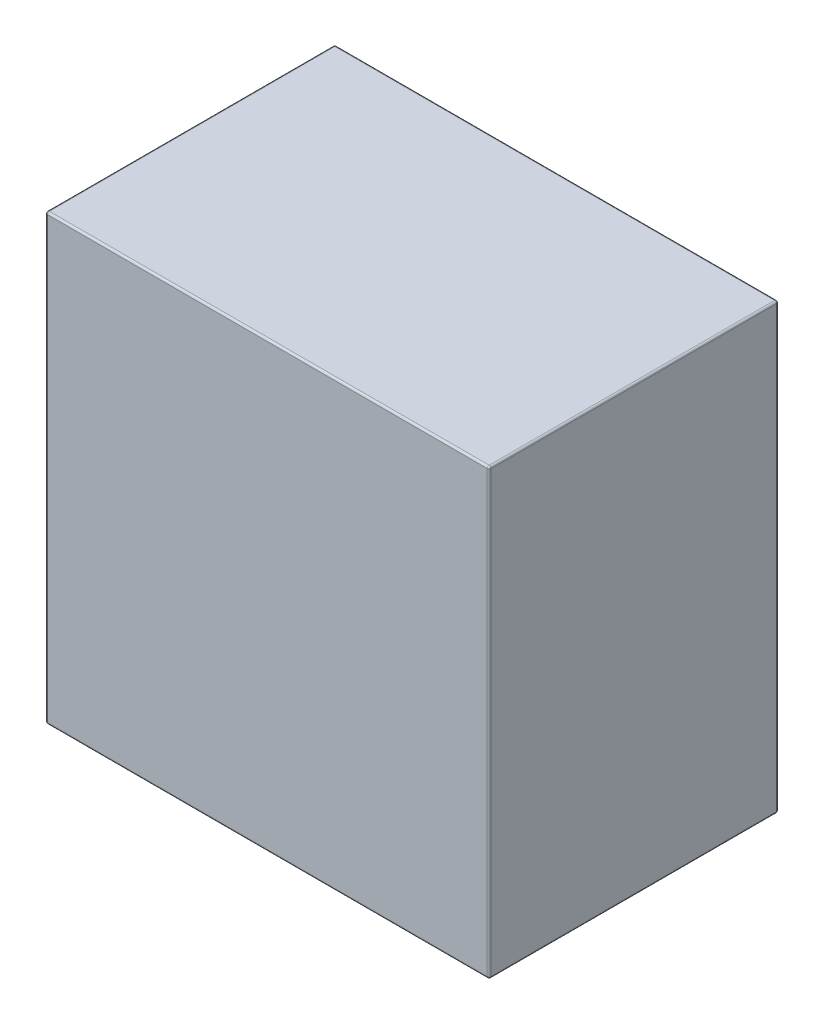
ISO-10303-21;
HEADER;
FILE_DESCRIPTION(('STEP AP214'),'2;1');
FILE_NAME('part.step','',(''),(''),'','','');
FILE_SCHEMA(('AUTOMOTIVE_DESIGN { 1 0 10303 214 1 1 1 1 }'));
ENDSEC;
DATA;
#1=APPLICATION_CONTEXT('core data for automotive mechanical design processes');
#2=APPLICATION_PROTOCOL_DEFINITION('international standard','automotive_design',2000,#1);
#3=PRODUCT_CONTEXT('',#1,'mechanical');
#4=PRODUCT('Part','Part','',(#3));
#5=PRODUCT_RELATED_PRODUCT_CATEGORY('part','',(#4));
#6=PRODUCT_DEFINITION_FORMATION('','',#4);
#7=PRODUCT_DEFINITION_CONTEXT('part definition',#1,'design');
#8=PRODUCT_DEFINITION('design','',#6,#7);
#9=PRODUCT_DEFINITION_SHAPE('','',#8);
#10=(LENGTH_UNIT() NAMED_UNIT(*) SI_UNIT(.MILLI.,.METRE.));
#11=(NAMED_UNIT(*) PLANE_ANGLE_UNIT() SI_UNIT($,.RADIAN.));
#12=(NAMED_UNIT(*) SI_UNIT($,.STERADIAN.) SOLID_ANGLE_UNIT());
#13=UNCERTAINTY_MEASURE_WITH_UNIT(LENGTH_MEASURE(1.E-05),#10,'distance_accuracy_value','');
#14=(GEOMETRIC_REPRESENTATION_CONTEXT(3) GLOBAL_UNCERTAINTY_ASSIGNED_CONTEXT((#13)) GLOBAL_UNIT_ASSIGNED_CONTEXT((#10,
#11,#12)) REPRESENTATION_CONTEXT('',''));
#15=CARTESIAN_POINT('',(0.,0.,0.));
#16=DIRECTION('',(0.,0.,1.));
#17=DIRECTION('',(1.,0.,0.));
#18=AXIS2_PLACEMENT_3D('',#15,#16,#17);
#19=CARTESIAN_POINT('',(11.5,11.5,15.));
#20=DIRECTION('',(0.,-1.,0.));
#21=DIRECTION('',(0.,0.,-1.));
#22=AXIS2_PLACEMENT_3D('',#19,#20,#21);
#23=PLANE('',#22);
#24=DIRECTION('',(0.,0.,-1.));
#25=VECTOR('',#24,1.);
#26=CARTESIAN_POINT('',(-11.4,11.5,15.));
#27=LINE('',#26,#25);
#28=CARTESIAN_POINT('',(-11.4,11.5,0.0999999999999994));
#29=VERTEX_POINT('',#28);
#30=CARTESIAN_POINT('',(-11.4,11.5,14.9));
#31=VERTEX_POINT('',#30);
#32=EDGE_CURVE('E138',#29,#31,#27,.F.);
#33=ORIENTED_EDGE('',*,*,#32,.T.);
#34=DIRECTION('',(-1.,0.,0.));
#35=VECTOR('',#34,1.);
#36=CARTESIAN_POINT('',(11.5,11.5,14.9));
#37=LINE('',#36,#35);
#38=CARTESIAN_POINT('',(11.4,11.5,14.9));
#39=VERTEX_POINT('',#38);
#40=EDGE_CURVE('E175',#31,#39,#37,.F.);
#41=ORIENTED_EDGE('',*,*,#40,.T.);
#42=DIRECTION('',(0.,0.,-1.));
#43=VECTOR('',#42,1.);
#44=CARTESIAN_POINT('',(11.4,11.5,15.));
#45=LINE('',#44,#43);
#46=CARTESIAN_POINT('',(11.4,11.5,0.0999999999999994));
#47=VERTEX_POINT('',#46);
#48=EDGE_CURVE('E172',#39,#47,#45,.T.);
#49=ORIENTED_EDGE('',*,*,#48,.T.);
#50=DIRECTION('',(-1.,0.,0.));
#51=VECTOR('',#50,1.);
#52=CARTESIAN_POINT('',(-11.5,11.5,0.0999999999999994));
#53=LINE('',#52,#51);
#54=EDGE_CURVE('E167',#47,#29,#53,.T.);
#55=ORIENTED_EDGE('',*,*,#54,.T.);
#56=EDGE_LOOP('',(#33,#41,#49,#55));
#57=FACE_BOUND('',#56,.T.);
#58=ADVANCED_FACE('F43',(#57),#23,.F.);
#59=CARTESIAN_POINT('',(-11.5,-11.5,15.));
#60=DIRECTION('',(1.,0.,0.));
#61=DIRECTION('',(0.,0.,-1.));
#62=AXIS2_PLACEMENT_3D('',#59,#60,#61);
#63=PLANE('',#62);
#64=DIRECTION('',(0.,0.,-1.));
#65=VECTOR('',#64,1.);
#66=CARTESIAN_POINT('',(-11.5,-11.4,15.));
#67=LINE('',#66,#65);
#68=CARTESIAN_POINT('',(-11.5,-11.4,0.0999999999999994));
#69=VERTEX_POINT('',#68);
#70=CARTESIAN_POINT('',(-11.5,-11.4,14.9));
#71=VERTEX_POINT('',#70);
#72=EDGE_CURVE('E160',#69,#71,#67,.F.);
#73=ORIENTED_EDGE('',*,*,#72,.T.);
#74=DIRECTION('',(0.,-1.,0.));
#75=VECTOR('',#74,1.);
#76=CARTESIAN_POINT('',(-11.5,-11.5,14.9));
#77=LINE('',#76,#75);
#78=CARTESIAN_POINT('',(-11.5,11.4,14.9));
#79=VERTEX_POINT('',#78);
#80=EDGE_CURVE('E164',#71,#79,#77,.F.);
#81=ORIENTED_EDGE('',*,*,#80,.T.);
#82=DIRECTION('',(0.,0.,-1.));
#83=VECTOR('',#82,1.);
#84=CARTESIAN_POINT('',(-11.5,11.4,15.));
#85=LINE('',#84,#83);
#86=CARTESIAN_POINT('',(-11.5,11.4,0.0999999999999994));
#87=VERTEX_POINT('',#86);
#88=EDGE_CURVE('E136',#79,#87,#85,.T.);
#89=ORIENTED_EDGE('',*,*,#88,.T.);
#90=DIRECTION('',(0.,-1.,0.));
#91=VECTOR('',#90,1.);
#92=CARTESIAN_POINT('',(-11.5,-11.5,0.0999999999999994));
#93=LINE('',#92,#91);
#94=EDGE_CURVE('E154',#87,#69,#93,.T.);
#95=ORIENTED_EDGE('',*,*,#94,.T.);
#96=EDGE_LOOP('',(#73,#81,#89,#95));
#97=FACE_BOUND('',#96,.T.);
#98=ADVANCED_FACE('F162',(#97),#63,.F.);
#99=CARTESIAN_POINT('',(11.5,-11.5,15.));
#100=DIRECTION('',(0.,1.,0.));
#101=DIRECTION('',(0.,0.,1.));
#102=AXIS2_PLACEMENT_3D('',#99,#100,#101);
#103=PLANE('',#102);
#104=DIRECTION('',(0.,0.,-1.));
#105=VECTOR('',#104,1.);
#106=CARTESIAN_POINT('',(11.4,-11.5,15.));
#107=LINE('',#106,#105);
#108=CARTESIAN_POINT('',(11.4,-11.5,0.0999999999999994));
#109=VERTEX_POINT('',#108);
#110=CARTESIAN_POINT('',(11.4,-11.5,14.9));
#111=VERTEX_POINT('',#110);
#112=EDGE_CURVE('E179',#109,#111,#107,.F.);
#113=ORIENTED_EDGE('',*,*,#112,.T.);
#114=DIRECTION('',(1.,0.,0.));
#115=VECTOR('',#114,1.);
#116=CARTESIAN_POINT('',(11.5,-11.5,14.9));
#117=LINE('',#116,#115);
#118=CARTESIAN_POINT('',(-11.4,-11.5,14.9));
#119=VERTEX_POINT('',#118);
#120=EDGE_CURVE('E184',#111,#119,#117,.F.);
#121=ORIENTED_EDGE('',*,*,#120,.T.);
#122=DIRECTION('',(0.,0.,-1.));
#123=VECTOR('',#122,1.);
#124=CARTESIAN_POINT('',(-11.4,-11.5,15.));
#125=LINE('',#124,#123);
#126=CARTESIAN_POINT('',(-11.4,-11.5,0.0999999999999994));
#127=VERTEX_POINT('',#126);
#128=EDGE_CURVE('E181',#119,#127,#125,.T.);
#129=ORIENTED_EDGE('',*,*,#128,.T.);
#130=DIRECTION('',(1.,0.,0.));
#131=VECTOR('',#130,1.);
#132=CARTESIAN_POINT('',(11.5,-11.5,0.0999999999999994));
#133=LINE('',#132,#131);
#134=EDGE_CURVE('E177',#127,#109,#133,.T.);
#135=ORIENTED_EDGE('',*,*,#134,.T.);
#136=EDGE_LOOP('',(#113,#121,#129,#135));
#137=FACE_BOUND('',#136,.T.);
#138=ADVANCED_FACE('F289',(#137),#103,.F.);
#139=CARTESIAN_POINT('',(11.5,-11.5,15.));
#140=DIRECTION('',(-1.,0.,0.));
#141=DIRECTION('',(0.,0.,1.));
#142=AXIS2_PLACEMENT_3D('',#139,#140,#141);
#143=PLANE('',#142);
#144=DIRECTION('',(0.,0.,-1.));
#145=VECTOR('',#144,1.);
#146=CARTESIAN_POINT('',(11.5,11.4,15.));
#147=LINE('',#146,#145);
#148=CARTESIAN_POINT('',(11.5,11.4,0.0999999999999994));
#149=VERTEX_POINT('',#148);
#150=CARTESIAN_POINT('',(11.5,11.4,14.9));
#151=VERTEX_POINT('',#150);
#152=EDGE_CURVE('E188',#149,#151,#147,.F.);
#153=ORIENTED_EDGE('',*,*,#152,.T.);
#154=DIRECTION('',(0.,1.,0.));
#155=VECTOR('',#154,1.);
#156=CARTESIAN_POINT('',(11.5,-11.5,14.9));
#157=LINE('',#156,#155);
#158=CARTESIAN_POINT('',(11.5,-11.4,14.9));
#159=VERTEX_POINT('',#158);
#160=EDGE_CURVE('E193',#151,#159,#157,.F.);
#161=ORIENTED_EDGE('',*,*,#160,.T.);
#162=DIRECTION('',(0.,0.,-1.));
#163=VECTOR('',#162,1.);
#164=CARTESIAN_POINT('',(11.5,-11.4,15.));
#165=LINE('',#164,#163);
#166=CARTESIAN_POINT('',(11.5,-11.4,0.0999999999999994));
#167=VERTEX_POINT('',#166);
#168=EDGE_CURVE('E190',#159,#167,#165,.T.);
#169=ORIENTED_EDGE('',*,*,#168,.T.);
#170=DIRECTION('',(0.,1.,0.));
#171=VECTOR('',#170,1.);
#172=CARTESIAN_POINT('',(11.5,11.5,0.0999999999999994));
#173=LINE('',#172,#171);
#174=EDGE_CURVE('E186',#167,#149,#173,.T.);
#175=ORIENTED_EDGE('',*,*,#174,.T.);
#176=EDGE_LOOP('',(#153,#161,#169,#175));
#177=FACE_BOUND('',#176,.T.);
#178=ADVANCED_FACE('F299',(#177),#143,.F.);
#179=CARTESIAN_POINT('',(0.,0.,15.));
#180=DIRECTION('',(0.,0.,-1.));
#181=DIRECTION('',(-1.,0.,0.));
#182=AXIS2_PLACEMENT_3D('',#179,#180,#181);
#183=PLANE('',#182);
#184=DIRECTION('',(1.,0.,0.));
#185=VECTOR('',#184,1.);
#186=CARTESIAN_POINT('',(0.,-11.4,15.));
#187=LINE('',#186,#185);
#188=CARTESIAN_POINT('',(-11.4,-11.4,15.));
#189=VERTEX_POINT('',#188);
#190=CARTESIAN_POINT('',(11.4,-11.4,15.));
#191=VERTEX_POINT('',#190);
#192=EDGE_CURVE('E199',#189,#191,#187,.T.);
#193=ORIENTED_EDGE('',*,*,#192,.T.);
#194=DIRECTION('',(0.,1.,0.));
#195=VECTOR('',#194,1.);
#196=CARTESIAN_POINT('',(11.4,0.,15.));
#197=LINE('',#196,#195);
#198=CARTESIAN_POINT('',(11.4,11.4,15.));
#199=VERTEX_POINT('',#198);
#200=EDGE_CURVE('E201',#191,#199,#197,.T.);
#201=ORIENTED_EDGE('',*,*,#200,.T.);
#202=DIRECTION('',(-1.,0.,0.));
#203=VECTOR('',#202,1.);
#204=CARTESIAN_POINT('',(0.,11.4,15.));
#205=LINE('',#204,#203);
#206=CARTESIAN_POINT('',(-11.4,11.4,15.));
#207=VERTEX_POINT('',#206);
#208=EDGE_CURVE('E195',#199,#207,#205,.T.);
#209=ORIENTED_EDGE('',*,*,#208,.T.);
#210=DIRECTION('',(0.,-1.,0.));
#211=VECTOR('',#210,1.);
#212=CARTESIAN_POINT('',(-11.4,0.,15.));
#213=LINE('',#212,#211);
#214=EDGE_CURVE('E197',#207,#189,#213,.T.);
#215=ORIENTED_EDGE('',*,*,#214,.T.);
#216=EDGE_LOOP('',(#193,#201,#209,#215));
#217=FACE_BOUND('',#216,.T.);
#218=ADVANCED_FACE('F281',(#217),#183,.F.);
#219=CARTESIAN_POINT('',(0.,0.,0.));
#220=DIRECTION('',(0.,0.,-1.));
#221=DIRECTION('',(-1.,0.,0.));
#222=AXIS2_PLACEMENT_3D('',#219,#220,#221);
#223=PLANE('',#222);
#224=DIRECTION('',(-1.,0.,0.));
#225=VECTOR('',#224,1.);
#226=CARTESIAN_POINT('',(11.5,11.4,0.));
#227=LINE('',#226,#225);
#228=CARTESIAN_POINT('',(-11.4,11.4,0.));
#229=VERTEX_POINT('',#228);
#230=CARTESIAN_POINT('',(11.4,11.4,0.));
#231=VERTEX_POINT('',#230);
#232=EDGE_CURVE('E204',#229,#231,#227,.F.);
#233=ORIENTED_EDGE('',*,*,#232,.T.);
#234=DIRECTION('',(0.,1.,0.));
#235=VECTOR('',#234,1.);
#236=CARTESIAN_POINT('',(11.4,-11.5,0.));
#237=LINE('',#236,#235);
#238=CARTESIAN_POINT('',(11.4,-11.4,0.));
#239=VERTEX_POINT('',#238);
#240=EDGE_CURVE('E11',#231,#239,#237,.F.);
#241=ORIENTED_EDGE('',*,*,#240,.T.);
#242=DIRECTION('',(1.,0.,0.));
#243=VECTOR('',#242,1.);
#244=CARTESIAN_POINT('',(-11.5,-11.4,0.));
#245=LINE('',#244,#243);
#246=CARTESIAN_POINT('',(-11.4,-11.4,0.));
#247=VERTEX_POINT('',#246);
#248=EDGE_CURVE('E52',#239,#247,#245,.F.);
#249=ORIENTED_EDGE('',*,*,#248,.T.);
#250=DIRECTION('',(0.,-1.,0.));
#251=VECTOR('',#250,1.);
#252=CARTESIAN_POINT('',(-11.4,11.5,0.));
#253=LINE('',#252,#251);
#254=EDGE_CURVE('E206',#247,#229,#253,.F.);
#255=ORIENTED_EDGE('',*,*,#254,.T.);
#256=EDGE_LOOP('',(#233,#241,#249,#255));
#257=FACE_BOUND('',#256,.T.);
#258=ADVANCED_FACE('F487',(#257),#223,.T.);
#259=CARTESIAN_POINT('',(11.4,-11.4,15.));
#260=DIRECTION('',(0.,0.,-1.));
#261=DIRECTION('',(-1.,0.,0.));
#262=AXIS2_PLACEMENT_3D('',#259,#260,#261);
#263=CYLINDRICAL_SURFACE('',#262,0.1);
#264=CARTESIAN_POINT('',(11.4,-11.4,14.9));
#265=DIRECTION('',(0.,0.,1.));
#266=DIRECTION('',(1.,0.,0.));
#267=AXIS2_PLACEMENT_3D('',#264,#265,#266);
#268=CIRCLE('',#267,0.1);
#269=EDGE_CURVE('E47',#111,#159,#268,.T.);
#270=ORIENTED_EDGE('',*,*,#269,.F.);
#271=ORIENTED_EDGE('',*,*,#112,.F.);
#272=CARTESIAN_POINT('',(11.4,-11.4,0.0999999999999994));
#273=DIRECTION('',(0.,0.,-1.));
#274=DIRECTION('',(-1.,0.,0.));
#275=AXIS2_PLACEMENT_3D('',#272,#273,#274);
#276=CIRCLE('',#275,0.1);
#277=EDGE_CURVE('E259',#167,#109,#276,.T.);
#278=ORIENTED_EDGE('',*,*,#277,.F.);
#279=ORIENTED_EDGE('',*,*,#168,.F.);
#280=EDGE_LOOP('',(#270,#271,#278,#279));
#281=FACE_BOUND('',#280,.T.);
#282=ADVANCED_FACE('F45',(#281),#263,.T.);
#283=CARTESIAN_POINT('',(11.4,-11.4,14.9));
#284=DIRECTION('',(1.,0.,0.));
#285=DIRECTION('',(0.,0.,-1.));
#286=AXIS2_PLACEMENT_3D('',#283,#284,#285);
#287=SPHERICAL_SURFACE('',#286,0.1);
#288=CARTESIAN_POINT('',(11.4,-11.4,14.9));
#289=DIRECTION('',(1.,0.,0.));
#290=DIRECTION('',(0.,0.,-1.));
#291=AXIS2_PLACEMENT_3D('',#288,#289,#290);
#292=CIRCLE('',#291,0.1);
#293=EDGE_CURVE('E254',#111,#191,#292,.F.);
#294=ORIENTED_EDGE('',*,*,#293,.F.);
#295=ORIENTED_EDGE('',*,*,#269,.T.);
#296=CARTESIAN_POINT('',(11.4,-11.4,14.9));
#297=DIRECTION('',(0.,-1.,0.));
#298=DIRECTION('',(0.,0.,-1.));
#299=AXIS2_PLACEMENT_3D('',#296,#297,#298);
#300=CIRCLE('',#299,0.1);
#301=EDGE_CURVE('E257',#191,#159,#300,.F.);
#302=ORIENTED_EDGE('',*,*,#301,.F.);
#303=EDGE_LOOP('',(#294,#295,#302));
#304=FACE_BOUND('',#303,.T.);
#305=ADVANCED_FACE('F269',(#304),#287,.T.);
#306=CARTESIAN_POINT('',(11.4,-11.4,0.1));
#307=DIRECTION('',(0.,-1.,0.));
#308=DIRECTION('',(0.,0.,-1.));
#309=AXIS2_PLACEMENT_3D('',#306,#307,#308);
#310=SPHERICAL_SURFACE('',#309,0.1);
#311=CARTESIAN_POINT('',(11.4,-11.4,0.1));
#312=DIRECTION('',(0.,-1.,0.));
#313=DIRECTION('',(0.,0.,-1.));
#314=AXIS2_PLACEMENT_3D('',#311,#312,#313);
#315=CIRCLE('',#314,0.1);
#316=EDGE_CURVE('E249',#167,#239,#315,.F.);
#317=ORIENTED_EDGE('',*,*,#316,.F.);
#318=ORIENTED_EDGE('',*,*,#277,.T.);
#319=CARTESIAN_POINT('',(11.4,-11.4,0.0999999999999994));
#320=DIRECTION('',(1.,0.,0.));
#321=DIRECTION('',(0.,0.,-1.));
#322=AXIS2_PLACEMENT_3D('',#319,#320,#321);
#323=CIRCLE('',#322,0.1);
#324=EDGE_CURVE('E252',#239,#109,#323,.F.);
#325=ORIENTED_EDGE('',*,*,#324,.F.);
#326=EDGE_LOOP('',(#317,#318,#325));
#327=FACE_BOUND('',#326,.T.);
#328=ADVANCED_FACE('F466',(#327),#310,.T.);
#329=CARTESIAN_POINT('',(11.4,0.,14.9));
#330=DIRECTION('',(0.,1.,0.));
#331=DIRECTION('',(0.,0.,1.));
#332=AXIS2_PLACEMENT_3D('',#329,#330,#331);
#333=CYLINDRICAL_SURFACE('',#332,0.1);
#334=ORIENTED_EDGE('',*,*,#301,.T.);
#335=ORIENTED_EDGE('',*,*,#160,.F.);
#336=CARTESIAN_POINT('',(11.4,11.4,14.9));
#337=DIRECTION('',(0.,1.,0.));
#338=DIRECTION('',(0.,0.,1.));
#339=AXIS2_PLACEMENT_3D('',#336,#337,#338);
#340=CIRCLE('',#339,0.1);
#341=EDGE_CURVE('E243',#199,#151,#340,.T.);
#342=ORIENTED_EDGE('',*,*,#341,.F.);
#343=ORIENTED_EDGE('',*,*,#200,.F.);
#344=EDGE_LOOP('',(#334,#335,#342,#343));
#345=FACE_BOUND('',#344,.T.);
#346=ADVANCED_FACE('F277',(#345),#333,.T.);
#347=CARTESIAN_POINT('',(0.,-11.4,14.9));
#348=DIRECTION('',(1.,0.,0.));
#349=DIRECTION('',(0.,0.,-1.));
#350=AXIS2_PLACEMENT_3D('',#347,#348,#349);
#351=CYLINDRICAL_SURFACE('',#350,0.1);
#352=ORIENTED_EDGE('',*,*,#293,.T.);
#353=ORIENTED_EDGE('',*,*,#192,.F.);
#354=CARTESIAN_POINT('',(-11.4,-11.4,14.9));
#355=DIRECTION('',(-1.,0.,0.));
#356=DIRECTION('',(0.,0.,1.));
#357=AXIS2_PLACEMENT_3D('',#354,#355,#356);
#358=CIRCLE('',#357,0.1);
#359=EDGE_CURVE('E240',#119,#189,#358,.T.);
#360=ORIENTED_EDGE('',*,*,#359,.F.);
#361=ORIENTED_EDGE('',*,*,#120,.F.);
#362=EDGE_LOOP('',(#352,#353,#360,#361));
#363=FACE_BOUND('',#362,.T.);
#364=ADVANCED_FACE('F286',(#363),#351,.T.);
#365=CARTESIAN_POINT('',(-11.4,-11.4,15.));
#366=DIRECTION('',(0.,0.,-1.));
#367=DIRECTION('',(-1.,0.,0.));
#368=AXIS2_PLACEMENT_3D('',#365,#366,#367);
#369=CYLINDRICAL_SURFACE('',#368,0.1);
#370=CARTESIAN_POINT('',(-11.4,-11.4,0.0999999999999994));
#371=DIRECTION('',(0.,0.,-1.));
#372=DIRECTION('',(-1.,0.,0.));
#373=AXIS2_PLACEMENT_3D('',#370,#371,#372);
#374=CIRCLE('',#373,0.1);
#375=EDGE_CURVE('E234',#127,#69,#374,.T.);
#376=ORIENTED_EDGE('',*,*,#375,.F.);
#377=ORIENTED_EDGE('',*,*,#128,.F.);
#378=CARTESIAN_POINT('',(-11.4,-11.4,14.9));
#379=DIRECTION('',(0.,0.,1.));
#380=DIRECTION('',(1.,0.,0.));
#381=AXIS2_PLACEMENT_3D('',#378,#379,#380);
#382=CIRCLE('',#381,0.1);
#383=EDGE_CURVE('E237',#71,#119,#382,.T.);
#384=ORIENTED_EDGE('',*,*,#383,.F.);
#385=ORIENTED_EDGE('',*,*,#72,.F.);
#386=EDGE_LOOP('',(#376,#377,#384,#385));
#387=FACE_BOUND('',#386,.T.);
#388=ADVANCED_FACE('F293',(#387),#369,.T.);
#389=CARTESIAN_POINT('',(11.5,-11.4,0.0999999999999994));
#390=DIRECTION('',(-1.,0.,0.));
#391=DIRECTION('',(0.,0.,1.));
#392=AXIS2_PLACEMENT_3D('',#389,#390,#391);
#393=CYLINDRICAL_SURFACE('',#392,0.1);
#394=ORIENTED_EDGE('',*,*,#324,.T.);
#395=ORIENTED_EDGE('',*,*,#134,.F.);
#396=CARTESIAN_POINT('',(-11.4,-11.4,0.1));
#397=DIRECTION('',(-1.,0.,0.));
#398=DIRECTION('',(0.,0.,1.));
#399=AXIS2_PLACEMENT_3D('',#396,#397,#398);
#400=CIRCLE('',#399,0.1);
#401=EDGE_CURVE('E232',#247,#127,#400,.T.);
#402=ORIENTED_EDGE('',*,*,#401,.F.);
#403=ORIENTED_EDGE('',*,*,#248,.F.);
#404=EDGE_LOOP('',(#394,#395,#402,#403));
#405=FACE_BOUND('',#404,.T.);
#406=ADVANCED_FACE('F297',(#405),#393,.T.);
#407=CARTESIAN_POINT('',(11.4,-11.5,0.0999999999999994));
#408=DIRECTION('',(0.,-1.,0.));
#409=DIRECTION('',(0.,0.,-1.));
#410=AXIS2_PLACEMENT_3D('',#407,#408,#409);
#411=CYLINDRICAL_SURFACE('',#410,0.1);
#412=ORIENTED_EDGE('',*,*,#316,.T.);
#413=ORIENTED_EDGE('',*,*,#240,.F.);
#414=CARTESIAN_POINT('',(11.4,11.4,0.0999999999999994));
#415=DIRECTION('',(0.,1.,0.));
#416=DIRECTION('',(0.,0.,1.));
#417=AXIS2_PLACEMENT_3D('',#414,#415,#416);
#418=CIRCLE('',#417,0.1);
#419=EDGE_CURVE('E229',#149,#231,#418,.T.);
#420=ORIENTED_EDGE('',*,*,#419,.F.);
#421=ORIENTED_EDGE('',*,*,#174,.F.);
#422=EDGE_LOOP('',(#412,#413,#420,#421));
#423=FACE_BOUND('',#422,.T.);
#424=ADVANCED_FACE('F309',(#423),#411,.T.);
#425=CARTESIAN_POINT('',(11.4,11.4,15.));
#426=DIRECTION('',(0.,0.,-1.));
#427=DIRECTION('',(-1.,0.,0.));
#428=AXIS2_PLACEMENT_3D('',#425,#426,#427);
#429=CYLINDRICAL_SURFACE('',#428,0.1);
#430=CARTESIAN_POINT('',(11.4,11.4,14.9));
#431=DIRECTION('',(0.,0.,1.));
#432=DIRECTION('',(1.,0.,0.));
#433=AXIS2_PLACEMENT_3D('',#430,#431,#432);
#434=CIRCLE('',#433,0.1);
#435=EDGE_CURVE('E246',#151,#39,#434,.T.);
#436=ORIENTED_EDGE('',*,*,#435,.F.);
#437=ORIENTED_EDGE('',*,*,#152,.F.);
#438=CARTESIAN_POINT('',(11.4,11.4,0.0999999999999994));
#439=DIRECTION('',(0.,0.,-1.));
#440=DIRECTION('',(-1.,0.,0.));
#441=AXIS2_PLACEMENT_3D('',#438,#439,#440);
#442=CIRCLE('',#441,0.1);
#443=EDGE_CURVE('E226',#47,#149,#442,.T.);
#444=ORIENTED_EDGE('',*,*,#443,.F.);
#445=ORIENTED_EDGE('',*,*,#48,.F.);
#446=EDGE_LOOP('',(#436,#437,#444,#445));
#447=FACE_BOUND('',#446,.T.);
#448=ADVANCED_FACE('F304',(#447),#429,.T.);
#449=CARTESIAN_POINT('',(11.4,11.4,14.9));
#450=DIRECTION('',(1.,0.,0.));
#451=DIRECTION('',(0.,0.,-1.));
#452=AXIS2_PLACEMENT_3D('',#449,#450,#451);
#453=SPHERICAL_SURFACE('',#452,0.1);
#454=ORIENTED_EDGE('',*,*,#341,.T.);
#455=ORIENTED_EDGE('',*,*,#435,.T.);
#456=CARTESIAN_POINT('',(11.4,11.4,14.9));
#457=DIRECTION('',(1.,0.,0.));
#458=DIRECTION('',(0.,0.,-1.));
#459=AXIS2_PLACEMENT_3D('',#456,#457,#458);
#460=CIRCLE('',#459,0.1);
#461=EDGE_CURVE('E223',#199,#39,#460,.F.);
#462=ORIENTED_EDGE('',*,*,#461,.F.);
#463=EDGE_LOOP('',(#454,#455,#462));
#464=FACE_BOUND('',#463,.T.);
#465=ADVANCED_FACE('F320',(#464),#453,.T.);
#466=CARTESIAN_POINT('',(-11.4,-11.4,14.9));
#467=DIRECTION('',(0.,-1.,0.));
#468=DIRECTION('',(0.,0.,-1.));
#469=AXIS2_PLACEMENT_3D('',#466,#467,#468);
#470=SPHERICAL_SURFACE('',#469,0.1);
#471=ORIENTED_EDGE('',*,*,#383,.T.);
#472=ORIENTED_EDGE('',*,*,#359,.T.);
#473=CARTESIAN_POINT('',(-11.4,-11.4,14.9));
#474=DIRECTION('',(0.,-1.,0.));
#475=DIRECTION('',(0.,0.,-1.));
#476=AXIS2_PLACEMENT_3D('',#473,#474,#475);
#477=CIRCLE('',#476,0.1);
#478=EDGE_CURVE('E220',#71,#189,#477,.F.);
#479=ORIENTED_EDGE('',*,*,#478,.F.);
#480=EDGE_LOOP('',(#471,#472,#479));
#481=FACE_BOUND('',#480,.T.);
#482=ADVANCED_FACE('F330',(#481),#470,.T.);
#483=CARTESIAN_POINT('',(-11.4,-11.4,0.1));
#484=DIRECTION('',(0.,-1.,0.));
#485=DIRECTION('',(0.,0.,-1.));
#486=AXIS2_PLACEMENT_3D('',#483,#484,#485);
#487=SPHERICAL_SURFACE('',#486,0.1);
#488=ORIENTED_EDGE('',*,*,#401,.T.);
#489=ORIENTED_EDGE('',*,*,#375,.T.);
#490=CARTESIAN_POINT('',(-11.4,-11.4,0.0999999999999994));
#491=DIRECTION('',(0.,-1.,0.));
#492=DIRECTION('',(0.,0.,-1.));
#493=AXIS2_PLACEMENT_3D('',#490,#491,#492);
#494=CIRCLE('',#493,0.1);
#495=EDGE_CURVE('E157',#247,#69,#494,.F.);
#496=ORIENTED_EDGE('',*,*,#495,.F.);
#497=EDGE_LOOP('',(#488,#489,#496));
#498=FACE_BOUND('',#497,.T.);
#499=ADVANCED_FACE('F332',(#498),#487,.T.);
#500=CARTESIAN_POINT('',(11.4,11.4,0.1));
#501=DIRECTION('',(1.,0.,0.));
#502=DIRECTION('',(0.,0.,-1.));
#503=AXIS2_PLACEMENT_3D('',#500,#501,#502);
#504=SPHERICAL_SURFACE('',#503,0.1);
#505=ORIENTED_EDGE('',*,*,#443,.T.);
#506=ORIENTED_EDGE('',*,*,#419,.T.);
#507=CARTESIAN_POINT('',(11.4,11.4,0.1));
#508=DIRECTION('',(1.,0.,0.));
#509=DIRECTION('',(0.,0.,-1.));
#510=AXIS2_PLACEMENT_3D('',#507,#508,#509);
#511=CIRCLE('',#510,0.1);
#512=EDGE_CURVE('E216',#47,#231,#511,.F.);
#513=ORIENTED_EDGE('',*,*,#512,.F.);
#514=EDGE_LOOP('',(#505,#506,#513));
#515=FACE_BOUND('',#514,.T.);
#516=ADVANCED_FACE('F311',(#515),#504,.T.);
#517=CARTESIAN_POINT('',(0.,11.4,14.9));
#518=DIRECTION('',(-1.,0.,0.));
#519=DIRECTION('',(0.,0.,1.));
#520=AXIS2_PLACEMENT_3D('',#517,#518,#519);
#521=CYLINDRICAL_SURFACE('',#520,0.1);
#522=ORIENTED_EDGE('',*,*,#461,.T.);
#523=ORIENTED_EDGE('',*,*,#40,.F.);
#524=CARTESIAN_POINT('',(-11.4,11.4,14.9));
#525=DIRECTION('',(-1.,0.,0.));
#526=DIRECTION('',(0.,0.,1.));
#527=AXIS2_PLACEMENT_3D('',#524,#525,#526);
#528=CIRCLE('',#527,0.1);
#529=EDGE_CURVE('E213',#207,#31,#528,.T.);
#530=ORIENTED_EDGE('',*,*,#529,.F.);
#531=ORIENTED_EDGE('',*,*,#208,.F.);
#532=EDGE_LOOP('',(#522,#523,#530,#531));
#533=FACE_BOUND('',#532,.T.);
#534=ADVANCED_FACE('F322',(#533),#521,.T.);
#535=CARTESIAN_POINT('',(-11.4,0.,14.9));
#536=DIRECTION('',(0.,-1.,0.));
#537=DIRECTION('',(0.,0.,-1.));
#538=AXIS2_PLACEMENT_3D('',#535,#536,#537);
#539=CYLINDRICAL_SURFACE('',#538,0.1);
#540=ORIENTED_EDGE('',*,*,#478,.T.);
#541=ORIENTED_EDGE('',*,*,#214,.F.);
#542=CARTESIAN_POINT('',(-11.4,11.4,14.9));
#543=DIRECTION('',(0.,1.,0.));
#544=DIRECTION('',(0.,0.,1.));
#545=AXIS2_PLACEMENT_3D('',#542,#543,#544);
#546=CIRCLE('',#545,0.1);
#547=EDGE_CURVE('E151',#79,#207,#546,.T.);
#548=ORIENTED_EDGE('',*,*,#547,.F.);
#549=ORIENTED_EDGE('',*,*,#80,.F.);
#550=EDGE_LOOP('',(#540,#541,#548,#549));
#551=FACE_BOUND('',#550,.T.);
#552=ADVANCED_FACE('F328',(#551),#539,.T.);
#553=CARTESIAN_POINT('',(-11.4,-11.5,0.0999999999999994));
#554=DIRECTION('',(0.,1.,0.));
#555=DIRECTION('',(0.,0.,1.));
#556=AXIS2_PLACEMENT_3D('',#553,#554,#555);
#557=CYLINDRICAL_SURFACE('',#556,0.1);
#558=ORIENTED_EDGE('',*,*,#495,.T.);
#559=ORIENTED_EDGE('',*,*,#94,.F.);
#560=CARTESIAN_POINT('',(-11.4,11.4,0.1));
#561=DIRECTION('',(0.,1.,0.));
#562=DIRECTION('',(0.,0.,1.));
#563=AXIS2_PLACEMENT_3D('',#560,#561,#562);
#564=CIRCLE('',#563,0.1);
#565=EDGE_CURVE('E144',#229,#87,#564,.T.);
#566=ORIENTED_EDGE('',*,*,#565,.F.);
#567=ORIENTED_EDGE('',*,*,#254,.F.);
#568=EDGE_LOOP('',(#558,#559,#566,#567));
#569=FACE_BOUND('',#568,.T.);
#570=ADVANCED_FACE('F155',(#569),#557,.T.);
#571=CARTESIAN_POINT('',(11.5,11.4,0.0999999999999994));
#572=DIRECTION('',(1.,0.,0.));
#573=DIRECTION('',(0.,0.,-1.));
#574=AXIS2_PLACEMENT_3D('',#571,#572,#573);
#575=CYLINDRICAL_SURFACE('',#574,0.1);
#576=ORIENTED_EDGE('',*,*,#512,.T.);
#577=ORIENTED_EDGE('',*,*,#232,.F.);
#578=CARTESIAN_POINT('',(-11.4,11.4,0.0999999999999994));
#579=DIRECTION('',(-1.,0.,0.));
#580=DIRECTION('',(0.,0.,1.));
#581=AXIS2_PLACEMENT_3D('',#578,#579,#580);
#582=CIRCLE('',#581,0.1);
#583=EDGE_CURVE('E148',#29,#229,#582,.T.);
#584=ORIENTED_EDGE('',*,*,#583,.F.);
#585=ORIENTED_EDGE('',*,*,#54,.F.);
#586=EDGE_LOOP('',(#576,#577,#584,#585));
#587=FACE_BOUND('',#586,.T.);
#588=ADVANCED_FACE('F315',(#587),#575,.T.);
#589=CARTESIAN_POINT('',(-11.4,11.4,14.9));
#590=DIRECTION('',(0.,0.,1.));
#591=DIRECTION('',(1.,0.,0.));
#592=AXIS2_PLACEMENT_3D('',#589,#590,#591);
#593=SPHERICAL_SURFACE('',#592,0.1);
#594=ORIENTED_EDGE('',*,*,#547,.T.);
#595=ORIENTED_EDGE('',*,*,#529,.T.);
#596=CARTESIAN_POINT('',(-11.4,11.4,14.9));
#597=DIRECTION('',(0.,0.,1.));
#598=DIRECTION('',(1.,0.,0.));
#599=AXIS2_PLACEMENT_3D('',#596,#597,#598);
#600=CIRCLE('',#599,0.1);
#601=EDGE_CURVE('E141',#79,#31,#600,.F.);
#602=ORIENTED_EDGE('',*,*,#601,.F.);
#603=EDGE_LOOP('',(#594,#595,#602));
#604=FACE_BOUND('',#603,.T.);
#605=ADVANCED_FACE('F326',(#604),#593,.T.);
#606=CARTESIAN_POINT('',(-11.4,11.4,0.1));
#607=DIRECTION('',(0.,0.,-1.));
#608=DIRECTION('',(-1.,0.,0.));
#609=AXIS2_PLACEMENT_3D('',#606,#607,#608);
#610=SPHERICAL_SURFACE('',#609,0.1);
#611=ORIENTED_EDGE('',*,*,#583,.T.);
#612=ORIENTED_EDGE('',*,*,#565,.T.);
#613=CARTESIAN_POINT('',(-11.4,11.4,0.0999999999999994));
#614=DIRECTION('',(0.,0.,-1.));
#615=DIRECTION('',(-1.,0.,0.));
#616=AXIS2_PLACEMENT_3D('',#613,#614,#615);
#617=CIRCLE('',#616,0.1);
#618=EDGE_CURVE('E132',#29,#87,#617,.F.);
#619=ORIENTED_EDGE('',*,*,#618,.F.);
#620=EDGE_LOOP('',(#611,#612,#619));
#621=FACE_BOUND('',#620,.T.);
#622=ADVANCED_FACE('F146',(#621),#610,.T.);
#623=CARTESIAN_POINT('',(-11.4,11.4,15.));
#624=DIRECTION('',(0.,0.,-1.));
#625=DIRECTION('',(-1.,0.,0.));
#626=AXIS2_PLACEMENT_3D('',#623,#624,#625);
#627=CYLINDRICAL_SURFACE('',#626,0.1);
#628=ORIENTED_EDGE('',*,*,#601,.T.);
#629=ORIENTED_EDGE('',*,*,#32,.F.);
#630=ORIENTED_EDGE('',*,*,#618,.T.);
#631=ORIENTED_EDGE('',*,*,#88,.F.);
#632=EDGE_LOOP('',(#628,#629,#630,#631));
#633=FACE_BOUND('',#632,.T.);
#634=ADVANCED_FACE('F134',(#633),#627,.T.);
#635=CLOSED_SHELL('',(#58,#98,#138,#178,#218,#258,#282,#305,#328,#346,#364,#388,#406,#424,#448,
#465,#482,#499,#516,#534,#552,#570,#588,#605,#622,#634));
#636=MANIFOLD_SOLID_BREP('B2',#635);
#637=ADVANCED_BREP_SHAPE_REPRESENTATION('',(#18,#636),#14);
#638=SHAPE_DEFINITION_REPRESENTATION(#9,#637);
ENDSEC;
END-ISO-10303-21;
